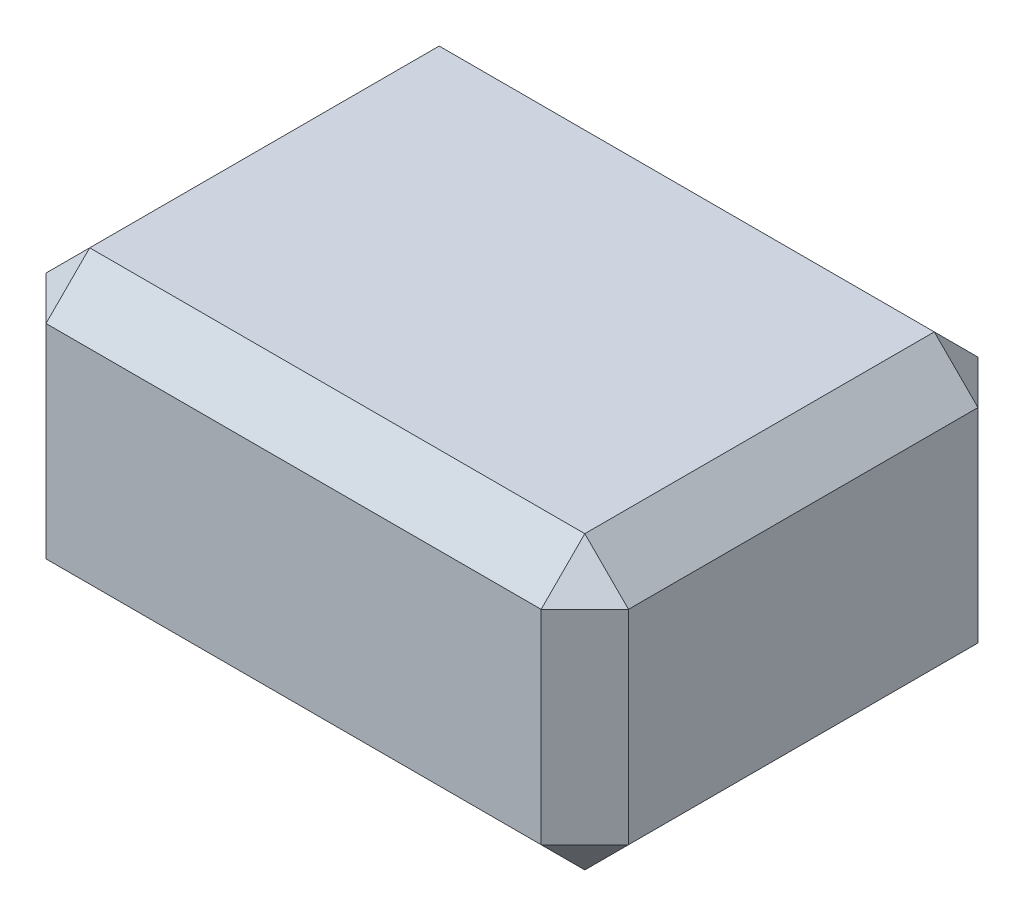
ISO-10303-21;
HEADER;
FILE_DESCRIPTION(('STEP AP214'),'2;1');
FILE_NAME('part.step','',(''),(''),'','','');
FILE_SCHEMA(('AUTOMOTIVE_DESIGN { 1 0 10303 214 1 1 1 1 }'));
ENDSEC;
DATA;
#1=APPLICATION_CONTEXT('core data for automotive mechanical design processes');
#2=APPLICATION_PROTOCOL_DEFINITION('international standard','automotive_design',2000,#1);
#3=PRODUCT_CONTEXT('',#1,'mechanical');
#4=PRODUCT('Part','Part','',(#3));
#5=PRODUCT_RELATED_PRODUCT_CATEGORY('part','',(#4));
#6=PRODUCT_DEFINITION_FORMATION('','',#4);
#7=PRODUCT_DEFINITION_CONTEXT('part definition',#1,'design');
#8=PRODUCT_DEFINITION('design','',#6,#7);
#9=PRODUCT_DEFINITION_SHAPE('','',#8);
#10=(LENGTH_UNIT() NAMED_UNIT(*) SI_UNIT(.MILLI.,.METRE.));
#11=(NAMED_UNIT(*) PLANE_ANGLE_UNIT() SI_UNIT($,.RADIAN.));
#12=(NAMED_UNIT(*) SI_UNIT($,.STERADIAN.) SOLID_ANGLE_UNIT());
#13=UNCERTAINTY_MEASURE_WITH_UNIT(LENGTH_MEASURE(1.E-05),#10,'distance_accuracy_value','');
#14=(GEOMETRIC_REPRESENTATION_CONTEXT(3) GLOBAL_UNCERTAINTY_ASSIGNED_CONTEXT((#13)) GLOBAL_UNIT_ASSIGNED_CONTEXT((#10,
#11,#12)) REPRESENTATION_CONTEXT('',''));
#15=CARTESIAN_POINT('',(0.,0.,0.));
#16=DIRECTION('',(0.,0.,1.));
#17=DIRECTION('',(1.,0.,0.));
#18=AXIS2_PLACEMENT_3D('',#15,#16,#17);
#19=CARTESIAN_POINT('',(-20.,20.,-15.));
#20=DIRECTION('',(1.,0.,0.));
#21=DIRECTION('',(0.,0.,-1.));
#22=AXIS2_PLACEMENT_3D('',#19,#20,#21);
#23=PLANE('',#22);
#24=DIRECTION('',(0.,0.,-1.));
#25=VECTOR('',#24,1.);
#26=CARTESIAN_POINT('',(-20.,17.,-15.));
#27=LINE('',#26,#25);
#28=CARTESIAN_POINT('',(-20.,17.,12.));
#29=VERTEX_POINT('',#28);
#30=CARTESIAN_POINT('',(-20.,17.,-12.));
#31=VERTEX_POINT('',#30);
#32=EDGE_CURVE('E162',#29,#31,#27,.T.);
#33=ORIENTED_EDGE('',*,*,#32,.T.);
#34=DIRECTION('',(0.,-1.,0.));
#35=VECTOR('',#34,1.);
#36=CARTESIAN_POINT('',(-20.,20.,-12.));
#37=LINE('',#36,#35);
#38=CARTESIAN_POINT('',(-20.,3.00000000000002,-12.));
#39=VERTEX_POINT('',#38);
#40=EDGE_CURVE('E165',#31,#39,#37,.T.);
#41=ORIENTED_EDGE('',*,*,#40,.T.);
#42=DIRECTION('',(0.,0.,1.));
#43=VECTOR('',#42,1.);
#44=CARTESIAN_POINT('',(-20.,3.00000000000002,-15.));
#45=LINE('',#44,#43);
#46=CARTESIAN_POINT('',(-20.,3.00000000000002,12.));
#47=VERTEX_POINT('',#46);
#48=EDGE_CURVE('E138',#39,#47,#45,.T.);
#49=ORIENTED_EDGE('',*,*,#48,.T.);
#50=DIRECTION('',(0.,1.,0.));
#51=VECTOR('',#50,1.);
#52=CARTESIAN_POINT('',(-20.,20.,12.));
#53=LINE('',#52,#51);
#54=EDGE_CURVE('E156',#47,#29,#53,.T.);
#55=ORIENTED_EDGE('',*,*,#54,.T.);
#56=EDGE_LOOP('',(#33,#41,#49,#55));
#57=FACE_BOUND('',#56,.T.);
#58=ADVANCED_FACE('F43',(#57),#23,.F.);
#59=CARTESIAN_POINT('',(-20.,20.,15.));
#60=DIRECTION('',(0.,0.,-1.));
#61=DIRECTION('',(-1.,0.,0.));
#62=AXIS2_PLACEMENT_3D('',#59,#60,#61);
#63=PLANE('',#62);
#64=DIRECTION('',(0.,-1.,0.));
#65=VECTOR('',#64,1.);
#66=CARTESIAN_POINT('',(-17.0000009803845,20.,15.));
#67=LINE('',#66,#65);
#68=CARTESIAN_POINT('',(-17.0000009803845,17.0000009803845,15.));
#69=VERTEX_POINT('',#68);
#70=CARTESIAN_POINT('',(-17.0000009803845,2.99999901961547,15.));
#71=VERTEX_POINT('',#70);
#72=EDGE_CURVE('E178',#69,#71,#67,.T.);
#73=ORIENTED_EDGE('',*,*,#72,.T.);
#74=DIRECTION('',(1.,0.,0.));
#75=VECTOR('',#74,1.);
#76=CARTESIAN_POINT('',(-20.,2.99999901961547,15.));
#77=LINE('',#76,#75);
#78=CARTESIAN_POINT('',(17.0000009803845,2.99999901961547,15.));
#79=VERTEX_POINT('',#78);
#80=EDGE_CURVE('E184',#71,#79,#77,.T.);
#81=ORIENTED_EDGE('',*,*,#80,.T.);
#82=DIRECTION('',(0.,1.,0.));
#83=VECTOR('',#82,1.);
#84=CARTESIAN_POINT('',(17.0000009803845,20.,15.));
#85=LINE('',#84,#83);
#86=CARTESIAN_POINT('',(17.0000009803845,17.0000009803845,15.));
#87=VERTEX_POINT('',#86);
#88=EDGE_CURVE('E182',#79,#87,#85,.T.);
#89=ORIENTED_EDGE('',*,*,#88,.T.);
#90=DIRECTION('',(-1.,0.,0.));
#91=VECTOR('',#90,1.);
#92=CARTESIAN_POINT('',(-20.,17.0000009803845,15.));
#93=LINE('',#92,#91);
#94=EDGE_CURVE('E180',#87,#69,#93,.T.);
#95=ORIENTED_EDGE('',*,*,#94,.T.);
#96=EDGE_LOOP('',(#73,#81,#89,#95));
#97=FACE_BOUND('',#96,.T.);
#98=ADVANCED_FACE('F334',(#97),#63,.F.);
#99=CARTESIAN_POINT('',(20.,20.,15.));
#100=DIRECTION('',(-1.,0.,0.));
#101=DIRECTION('',(0.,0.,1.));
#102=AXIS2_PLACEMENT_3D('',#99,#100,#101);
#103=PLANE('',#102);
#104=DIRECTION('',(0.,-1.,0.));
#105=VECTOR('',#104,1.);
#106=CARTESIAN_POINT('',(20.,20.,12.));
#107=LINE('',#106,#105);
#108=CARTESIAN_POINT('',(20.,17.,12.));
#109=VERTEX_POINT('',#108);
#110=CARTESIAN_POINT('',(20.,2.99999901961547,12.));
#111=VERTEX_POINT('',#110);
#112=EDGE_CURVE('E187',#109,#111,#107,.T.);
#113=ORIENTED_EDGE('',*,*,#112,.T.);
#114=DIRECTION('',(0.,0.,-1.));
#115=VECTOR('',#114,1.);
#116=CARTESIAN_POINT('',(20.,2.99999901961547,15.));
#117=LINE('',#116,#115);
#118=CARTESIAN_POINT('',(20.,2.99999901961547,-12.));
#119=VERTEX_POINT('',#118);
#120=EDGE_CURVE('E193',#111,#119,#117,.T.);
#121=ORIENTED_EDGE('',*,*,#120,.T.);
#122=DIRECTION('',(0.,1.,0.));
#123=VECTOR('',#122,1.);
#124=CARTESIAN_POINT('',(20.,20.,-12.));
#125=LINE('',#124,#123);
#126=CARTESIAN_POINT('',(20.,17.,-12.));
#127=VERTEX_POINT('',#126);
#128=EDGE_CURVE('E191',#119,#127,#125,.T.);
#129=ORIENTED_EDGE('',*,*,#128,.T.);
#130=DIRECTION('',(0.,0.,1.));
#131=VECTOR('',#130,1.);
#132=CARTESIAN_POINT('',(20.,17.,15.));
#133=LINE('',#132,#131);
#134=EDGE_CURVE('E189',#127,#109,#133,.T.);
#135=ORIENTED_EDGE('',*,*,#134,.T.);
#136=EDGE_LOOP('',(#113,#121,#129,#135));
#137=FACE_BOUND('',#136,.T.);
#138=ADVANCED_FACE('F304',(#137),#103,.F.);
#139=CARTESIAN_POINT('',(20.,20.,-15.));
#140=DIRECTION('',(0.,0.,1.));
#141=DIRECTION('',(1.,0.,0.));
#142=AXIS2_PLACEMENT_3D('',#139,#140,#141);
#143=PLANE('',#142);
#144=DIRECTION('',(0.,-1.,0.));
#145=VECTOR('',#144,1.);
#146=CARTESIAN_POINT('',(17.0000009803845,20.,-15.));
#147=LINE('',#146,#145);
#148=CARTESIAN_POINT('',(17.0000009803845,17.,-15.));
#149=VERTEX_POINT('',#148);
#150=CARTESIAN_POINT('',(17.0000009803845,2.99999901961547,-15.));
#151=VERTEX_POINT('',#150);
#152=EDGE_CURVE('E196',#149,#151,#147,.T.);
#153=ORIENTED_EDGE('',*,*,#152,.T.);
#154=DIRECTION('',(-1.,0.,0.));
#155=VECTOR('',#154,1.);
#156=CARTESIAN_POINT('',(20.,2.99999901961547,-15.));
#157=LINE('',#156,#155);
#158=CARTESIAN_POINT('',(-17.0000009803845,2.99999901961547,-15.));
#159=VERTEX_POINT('',#158);
#160=EDGE_CURVE('E202',#151,#159,#157,.T.);
#161=ORIENTED_EDGE('',*,*,#160,.T.);
#162=DIRECTION('',(0.,1.,0.));
#163=VECTOR('',#162,1.);
#164=CARTESIAN_POINT('',(-17.0000009803845,20.,-15.));
#165=LINE('',#164,#163);
#166=CARTESIAN_POINT('',(-17.0000009803845,17.,-15.));
#167=VERTEX_POINT('',#166);
#168=EDGE_CURVE('E200',#159,#167,#165,.T.);
#169=ORIENTED_EDGE('',*,*,#168,.T.);
#170=DIRECTION('',(1.,0.,0.));
#171=VECTOR('',#170,1.);
#172=CARTESIAN_POINT('',(20.,17.,-15.));
#173=LINE('',#172,#171);
#174=EDGE_CURVE('E198',#167,#149,#173,.T.);
#175=ORIENTED_EDGE('',*,*,#174,.T.);
#176=EDGE_LOOP('',(#153,#161,#169,#175));
#177=FACE_BOUND('',#176,.T.);
#178=ADVANCED_FACE('F277',(#177),#143,.F.);
#179=CARTESIAN_POINT('',(0.,20.,0.));
#180=DIRECTION('',(0.,1.,0.));
#181=DIRECTION('',(0.,0.,1.));
#182=AXIS2_PLACEMENT_3D('',#179,#180,#181);
#183=PLANE('',#182);
#184=DIRECTION('',(-1.,0.,0.));
#185=VECTOR('',#184,1.);
#186=CARTESIAN_POINT('',(-20.,20.,-12.0000009803845));
#187=LINE('',#186,#185);
#188=CARTESIAN_POINT('',(17.0000009803845,20.,-12.0000009803845));
#189=VERTEX_POINT('',#188);
#190=CARTESIAN_POINT('',(-17.0000009803845,20.,-12.0000009803845));
#191=VERTEX_POINT('',#190);
#192=EDGE_CURVE('E53',#189,#191,#187,.T.);
#193=ORIENTED_EDGE('',*,*,#192,.T.);
#194=DIRECTION('',(0.,0.,1.));
#195=VECTOR('',#194,1.);
#196=CARTESIAN_POINT('',(-17.0000009803845,20.,15.));
#197=LINE('',#196,#195);
#198=CARTESIAN_POINT('',(-17.0000009803845,20.,12.));
#199=VERTEX_POINT('',#198);
#200=EDGE_CURVE('E11',#191,#199,#197,.T.);
#201=ORIENTED_EDGE('',*,*,#200,.T.);
#202=DIRECTION('',(1.,0.,0.));
#203=VECTOR('',#202,1.);
#204=CARTESIAN_POINT('',(20.,20.,12.));
#205=LINE('',#204,#203);
#206=CARTESIAN_POINT('',(17.0000009803845,20.,12.));
#207=VERTEX_POINT('',#206);
#208=EDGE_CURVE('E205',#199,#207,#205,.T.);
#209=ORIENTED_EDGE('',*,*,#208,.T.);
#210=DIRECTION('',(0.,0.,-1.));
#211=VECTOR('',#210,1.);
#212=CARTESIAN_POINT('',(17.0000009803845,20.,-15.));
#213=LINE('',#212,#211);
#214=EDGE_CURVE('E64',#207,#189,#213,.T.);
#215=ORIENTED_EDGE('',*,*,#214,.T.);
#216=EDGE_LOOP('',(#193,#201,#209,#215));
#217=FACE_BOUND('',#216,.T.);
#218=ADVANCED_FACE('F292',(#217),#183,.T.);
#219=CARTESIAN_POINT('',(0.,0.,0.));
#220=DIRECTION('',(0.,1.,0.));
#221=DIRECTION('',(0.,0.,1.));
#222=AXIS2_PLACEMENT_3D('',#219,#220,#221);
#223=PLANE('',#222);
#224=DIRECTION('',(-1.,0.,0.));
#225=VECTOR('',#224,1.);
#226=CARTESIAN_POINT('',(0.,0.,12.));
#227=LINE('',#226,#225);
#228=CARTESIAN_POINT('',(17.,0.,12.));
#229=VERTEX_POINT('',#228);
#230=CARTESIAN_POINT('',(-17.0000009803845,0.,12.));
#231=VERTEX_POINT('',#230);
#232=EDGE_CURVE('E175',#229,#231,#227,.T.);
#233=ORIENTED_EDGE('',*,*,#232,.T.);
#234=DIRECTION('',(0.,0.,-1.));
#235=VECTOR('',#234,1.);
#236=CARTESIAN_POINT('',(-17.0000009803845,0.,0.));
#237=LINE('',#236,#235);
#238=CARTESIAN_POINT('',(-17.0000009803845,0.,-12.));
#239=VERTEX_POINT('',#238);
#240=EDGE_CURVE('E140',#231,#239,#237,.T.);
#241=ORIENTED_EDGE('',*,*,#240,.T.);
#242=DIRECTION('',(1.,0.,0.));
#243=VECTOR('',#242,1.);
#244=CARTESIAN_POINT('',(0.,0.,-12.));
#245=LINE('',#244,#243);
#246=CARTESIAN_POINT('',(17.,0.,-12.));
#247=VERTEX_POINT('',#246);
#248=EDGE_CURVE('E168',#239,#247,#245,.T.);
#249=ORIENTED_EDGE('',*,*,#248,.T.);
#250=DIRECTION('',(0.,0.,1.));
#251=VECTOR('',#250,1.);
#252=CARTESIAN_POINT('',(17.,0.,0.));
#253=LINE('',#252,#251);
#254=EDGE_CURVE('E173',#247,#229,#253,.T.);
#255=ORIENTED_EDGE('',*,*,#254,.T.);
#256=EDGE_LOOP('',(#233,#241,#249,#255));
#257=FACE_BOUND('',#256,.T.);
#258=ADVANCED_FACE('F424',(#257),#223,.F.);
#259=CARTESIAN_POINT('',(17.0000009803845,20.,0.));
#260=DIRECTION('',(0.707106896725984,0.707106665647092,0.));
#261=DIRECTION('',(0.,0.,1.));
#262=AXIS2_PLACEMENT_3D('',#259,#260,#261);
#263=PLANE('',#262);
#264=DIRECTION('',(0.707106665647073,-0.707106896725965,2.31078892403524E-07));
#265=VECTOR('',#264,1.);
#266=CARTESIAN_POINT('',(18.5000004901923,18.5,-12.0000004901923));
#267=LINE('',#266,#265);
#268=EDGE_CURVE('E48',#189,#127,#267,.T.);
#269=ORIENTED_EDGE('',*,*,#268,.F.);
#270=ORIENTED_EDGE('',*,*,#214,.F.);
#271=DIRECTION('',(-0.707106665647092,0.707106896725984,0.));
#272=VECTOR('',#271,1.);
#273=CARTESIAN_POINT('',(20.,17.,12.));
#274=LINE('',#273,#272);
#275=EDGE_CURVE('E257',#109,#207,#274,.T.);
#276=ORIENTED_EDGE('',*,*,#275,.F.);
#277=ORIENTED_EDGE('',*,*,#134,.F.);
#278=EDGE_LOOP('',(#269,#270,#276,#277));
#279=FACE_BOUND('',#278,.T.);
#280=ADVANCED_FACE('F46',(#279),#263,.T.);
#281=CARTESIAN_POINT('',(17.0000009803845,17.,-15.));
#282=DIRECTION('',(0.577350457864741,0.57735008051449,-0.577350269189585));
#283=DIRECTION('',(-0.707106665647092,0.,-0.707106896725984));
#284=AXIS2_PLACEMENT_3D('',#281,#282,#283);
#285=PLANE('',#284);
#286=DIRECTION('',(0.,0.707106896725984,0.707106665647092));
#287=VECTOR('',#286,1.);
#288=CARTESIAN_POINT('',(17.0000009803845,17.,-15.));
#289=LINE('',#288,#287);
#290=EDGE_CURVE('E252',#189,#149,#289,.F.);
#291=ORIENTED_EDGE('',*,*,#290,.F.);
#292=ORIENTED_EDGE('',*,*,#268,.T.);
#293=DIRECTION('',(0.707106665647092,0.,0.707106896725984));
#294=VECTOR('',#293,1.);
#295=CARTESIAN_POINT('',(17.0000009803845,17.,-15.));
#296=LINE('',#295,#294);
#297=EDGE_CURVE('E255',#149,#127,#296,.T.);
#298=ORIENTED_EDGE('',*,*,#297,.F.);
#299=EDGE_LOOP('',(#291,#292,#298));
#300=FACE_BOUND('',#299,.T.);
#301=ADVANCED_FACE('F267',(#300),#285,.T.);
#302=CARTESIAN_POINT('',(20.,17.,12.));
#303=DIRECTION('',(0.577350457864741,0.577350269189585,0.57735008051449));
#304=DIRECTION('',(-0.707106665647092,0.707106896725984,0.));
#305=AXIS2_PLACEMENT_3D('',#302,#303,#304);
#306=PLANE('',#305);
#307=DIRECTION('',(-0.707106665647073,2.31078892414246E-07,0.707106896725965));
#308=VECTOR('',#307,1.);
#309=CARTESIAN_POINT('',(20.,17.,12.));
#310=LINE('',#309,#308);
#311=EDGE_CURVE('E246',#109,#87,#310,.T.);
#312=ORIENTED_EDGE('',*,*,#311,.F.);
#313=ORIENTED_EDGE('',*,*,#275,.T.);
#314=DIRECTION('',(0.,-0.707106665647092,0.707106896725984));
#315=VECTOR('',#314,1.);
#316=CARTESIAN_POINT('',(17.0000009803845,18.5000004901923,13.4999999999999));
#317=LINE('',#316,#315);
#318=EDGE_CURVE('E249',#87,#207,#317,.F.);
#319=ORIENTED_EDGE('',*,*,#318,.F.);
#320=EDGE_LOOP('',(#312,#313,#319));
#321=FACE_BOUND('',#320,.T.);
#322=ADVANCED_FACE('F296',(#321),#306,.T.);
#323=CARTESIAN_POINT('',(17.0000009803845,20.,-15.));
#324=DIRECTION('',(-0.707106896725984,0.,0.707106665647092));
#325=DIRECTION('',(0.,-1.,0.));
#326=AXIS2_PLACEMENT_3D('',#323,#324,#325);
#327=PLANE('',#326);
#328=ORIENTED_EDGE('',*,*,#297,.T.);
#329=ORIENTED_EDGE('',*,*,#128,.F.);
#330=DIRECTION('',(-0.707106665647092,0.,-0.707106896725984));
#331=VECTOR('',#330,1.);
#332=CARTESIAN_POINT('',(20.,2.99999901961546,-12.));
#333=LINE('',#332,#331);
#334=EDGE_CURVE('E241',#151,#119,#333,.F.);
#335=ORIENTED_EDGE('',*,*,#334,.F.);
#336=ORIENTED_EDGE('',*,*,#152,.F.);
#337=EDGE_LOOP('',(#328,#329,#335,#336));
#338=FACE_BOUND('',#337,.T.);
#339=ADVANCED_FACE('F273',(#338),#327,.F.);
#340=CARTESIAN_POINT('',(0.,20.,-12.0000009803845));
#341=DIRECTION('',(0.,0.707106665647092,-0.707106896725984));
#342=DIRECTION('',(1.,0.,0.));
#343=AXIS2_PLACEMENT_3D('',#340,#341,#342);
#344=PLANE('',#343);
#345=ORIENTED_EDGE('',*,*,#290,.T.);
#346=ORIENTED_EDGE('',*,*,#174,.F.);
#347=DIRECTION('',(0.,-0.707106896725984,-0.707106665647092));
#348=VECTOR('',#347,1.);
#349=CARTESIAN_POINT('',(-17.0000009803845,18.4999999999999,-13.5000004901923));
#350=LINE('',#349,#348);
#351=EDGE_CURVE('E238',#191,#167,#350,.T.);
#352=ORIENTED_EDGE('',*,*,#351,.F.);
#353=ORIENTED_EDGE('',*,*,#192,.F.);
#354=EDGE_LOOP('',(#345,#346,#352,#353));
#355=FACE_BOUND('',#354,.T.);
#356=ADVANCED_FACE('F283',(#355),#344,.T.);
#357=CARTESIAN_POINT('',(-17.0000009803845,20.,0.));
#358=DIRECTION('',(-0.707106896725984,0.707106665647092,0.));
#359=DIRECTION('',(0.,0.,-1.));
#360=AXIS2_PLACEMENT_3D('',#357,#358,#359);
#361=PLANE('',#360);
#362=DIRECTION('',(-0.707106665647092,-0.707106896725984,0.));
#363=VECTOR('',#362,1.);
#364=CARTESIAN_POINT('',(-17.0000009803845,20.,12.));
#365=LINE('',#364,#363);
#366=EDGE_CURVE('E232',#199,#29,#365,.T.);
#367=ORIENTED_EDGE('',*,*,#366,.F.);
#368=ORIENTED_EDGE('',*,*,#200,.F.);
#369=DIRECTION('',(0.707106665647073,0.707106896725965,-2.31078892403524E-07));
#370=VECTOR('',#369,1.);
#371=CARTESIAN_POINT('',(-20.,17.,-12.));
#372=LINE('',#371,#370);
#373=EDGE_CURVE('E235',#31,#191,#372,.T.);
#374=ORIENTED_EDGE('',*,*,#373,.F.);
#375=ORIENTED_EDGE('',*,*,#32,.F.);
#376=EDGE_LOOP('',(#367,#368,#374,#375));
#377=FACE_BOUND('',#376,.T.);
#378=ADVANCED_FACE('F290',(#377),#361,.T.);
#379=CARTESIAN_POINT('',(0.,20.,12.));
#380=DIRECTION('',(0.,0.707106896725984,0.707106665647092));
#381=DIRECTION('',(-1.,0.,0.));
#382=AXIS2_PLACEMENT_3D('',#379,#380,#381);
#383=PLANE('',#382);
#384=ORIENTED_EDGE('',*,*,#318,.T.);
#385=ORIENTED_EDGE('',*,*,#208,.F.);
#386=DIRECTION('',(0.,0.707106665647092,-0.707106896725984));
#387=VECTOR('',#386,1.);
#388=CARTESIAN_POINT('',(-17.0000009803845,20.,12.));
#389=LINE('',#388,#387);
#390=EDGE_CURVE('E230',#69,#199,#389,.T.);
#391=ORIENTED_EDGE('',*,*,#390,.F.);
#392=ORIENTED_EDGE('',*,*,#94,.F.);
#393=EDGE_LOOP('',(#384,#385,#391,#392));
#394=FACE_BOUND('',#393,.T.);
#395=ADVANCED_FACE('F398',(#394),#383,.T.);
#396=CARTESIAN_POINT('',(20.,20.,12.));
#397=DIRECTION('',(-0.707106896725984,0.,-0.707106665647092));
#398=DIRECTION('',(0.,-1.,0.));
#399=AXIS2_PLACEMENT_3D('',#396,#397,#398);
#400=PLANE('',#399);
#401=ORIENTED_EDGE('',*,*,#311,.T.);
#402=ORIENTED_EDGE('',*,*,#88,.F.);
#403=DIRECTION('',(0.707106665647092,0.,-0.707106896725984));
#404=VECTOR('',#403,1.);
#405=CARTESIAN_POINT('',(17.0000009803845,2.99999901961547,15.));
#406=LINE('',#405,#404);
#407=EDGE_CURVE('E227',#111,#79,#406,.F.);
#408=ORIENTED_EDGE('',*,*,#407,.F.);
#409=ORIENTED_EDGE('',*,*,#112,.F.);
#410=EDGE_LOOP('',(#401,#402,#408,#409));
#411=FACE_BOUND('',#410,.T.);
#412=ADVANCED_FACE('F301',(#411),#400,.F.);
#413=CARTESIAN_POINT('',(20.,2.99999901961547,15.));
#414=DIRECTION('',(-0.707106665647092,0.707106896725984,0.));
#415=DIRECTION('',(0.,0.,-1.));
#416=AXIS2_PLACEMENT_3D('',#413,#414,#415);
#417=PLANE('',#416);
#418=DIRECTION('',(0.707106896725984,0.707106665647092,0.));
#419=VECTOR('',#418,1.);
#420=CARTESIAN_POINT('',(20.,2.99999901961547,-12.));
#421=LINE('',#420,#419);
#422=EDGE_CURVE('E243',#119,#247,#421,.F.);
#423=ORIENTED_EDGE('',*,*,#422,.F.);
#424=ORIENTED_EDGE('',*,*,#120,.F.);
#425=DIRECTION('',(-0.707106896725984,-0.707106665647092,0.));
#426=VECTOR('',#425,1.);
#427=CARTESIAN_POINT('',(18.5000000000001,1.49999950980781,12.));
#428=LINE('',#427,#426);
#429=EDGE_CURVE('E224',#229,#111,#428,.F.);
#430=ORIENTED_EDGE('',*,*,#429,.F.);
#431=ORIENTED_EDGE('',*,*,#254,.F.);
#432=EDGE_LOOP('',(#423,#424,#430,#431));
#433=FACE_BOUND('',#432,.T.);
#434=ADVANCED_FACE('F308',(#433),#417,.F.);
#435=CARTESIAN_POINT('',(20.,2.99999901961547,-12.));
#436=DIRECTION('',(0.577350269189585,-0.577350457864741,-0.57735008051449));
#437=DIRECTION('',(0.707106896725984,0.707106665647092,0.));
#438=AXIS2_PLACEMENT_3D('',#435,#436,#437);
#439=PLANE('',#438);
#440=ORIENTED_EDGE('',*,*,#334,.T.);
#441=ORIENTED_EDGE('',*,*,#422,.T.);
#442=DIRECTION('',(-2.31078892414246E-07,-0.707106665647073,0.707106896725965));
#443=VECTOR('',#442,1.);
#444=CARTESIAN_POINT('',(17.0000004901923,1.49999950980773,-13.5));
#445=LINE('',#444,#443);
#446=EDGE_CURVE('E221',#151,#247,#445,.T.);
#447=ORIENTED_EDGE('',*,*,#446,.F.);
#448=EDGE_LOOP('',(#440,#441,#447));
#449=FACE_BOUND('',#448,.T.);
#450=ADVANCED_FACE('F312',(#449),#439,.T.);
#451=CARTESIAN_POINT('',(-20.,17.,-12.));
#452=DIRECTION('',(-0.577350457864741,0.57735008051449,-0.577350269189585));
#453=DIRECTION('',(-0.707106665647092,0.,0.707106896725984));
#454=AXIS2_PLACEMENT_3D('',#451,#452,#453);
#455=PLANE('',#454);
#456=ORIENTED_EDGE('',*,*,#373,.T.);
#457=ORIENTED_EDGE('',*,*,#351,.T.);
#458=DIRECTION('',(0.707106665647092,0.,-0.707106896725984));
#459=VECTOR('',#458,1.);
#460=CARTESIAN_POINT('',(-20.,17.,-12.));
#461=LINE('',#460,#459);
#462=EDGE_CURVE('E218',#31,#167,#461,.T.);
#463=ORIENTED_EDGE('',*,*,#462,.F.);
#464=EDGE_LOOP('',(#456,#457,#463));
#465=FACE_BOUND('',#464,.T.);
#466=ADVANCED_FACE('F287',(#465),#455,.T.);
#467=CARTESIAN_POINT('',(-17.0000009803845,20.,12.));
#468=DIRECTION('',(-0.577350457864741,0.577350269189585,0.57735008051449));
#469=DIRECTION('',(-0.707106665647092,-0.707106896725984,0.));
#470=AXIS2_PLACEMENT_3D('',#467,#468,#469);
#471=PLANE('',#470);
#472=ORIENTED_EDGE('',*,*,#390,.T.);
#473=ORIENTED_EDGE('',*,*,#366,.T.);
#474=DIRECTION('',(-0.707106665647073,-2.31078892414246E-07,-0.707106896725965));
#475=VECTOR('',#474,1.);
#476=CARTESIAN_POINT('',(-18.5000004901923,17.0000004901923,13.5));
#477=LINE('',#476,#475);
#478=EDGE_CURVE('E159',#69,#29,#477,.T.);
#479=ORIENTED_EDGE('',*,*,#478,.F.);
#480=EDGE_LOOP('',(#472,#473,#479));
#481=FACE_BOUND('',#480,.T.);
#482=ADVANCED_FACE('F377',(#481),#471,.T.);
#483=CARTESIAN_POINT('',(17.0000009803845,2.99999901961547,15.));
#484=DIRECTION('',(0.577350269189585,-0.577350457864741,0.57735008051449));
#485=DIRECTION('',(0.707106896725984,0.707106665647092,0.));
#486=AXIS2_PLACEMENT_3D('',#483,#484,#485);
#487=PLANE('',#486);
#488=ORIENTED_EDGE('',*,*,#429,.T.);
#489=ORIENTED_EDGE('',*,*,#407,.T.);
#490=DIRECTION('',(2.31078892510394E-07,0.707106665647073,0.707106896725965));
#491=VECTOR('',#490,1.);
#492=CARTESIAN_POINT('',(17.0000009803845,2.99999901961547,15.));
#493=LINE('',#492,#491);
#494=EDGE_CURVE('E215',#229,#79,#493,.T.);
#495=ORIENTED_EDGE('',*,*,#494,.F.);
#496=EDGE_LOOP('',(#488,#489,#495));
#497=FACE_BOUND('',#496,.T.);
#498=ADVANCED_FACE('F372',(#497),#487,.T.);
#499=CARTESIAN_POINT('',(20.,2.99999901961547,-15.));
#500=DIRECTION('',(0.,0.707106896725984,0.707106665647092));
#501=DIRECTION('',(-1.,0.,0.));
#502=AXIS2_PLACEMENT_3D('',#499,#500,#501);
#503=PLANE('',#502);
#504=ORIENTED_EDGE('',*,*,#446,.T.);
#505=ORIENTED_EDGE('',*,*,#248,.F.);
#506=DIRECTION('',(0.,0.707106665647092,-0.707106896725984));
#507=VECTOR('',#506,1.);
#508=CARTESIAN_POINT('',(-17.0000009803845,0.,-12.));
#509=LINE('',#508,#507);
#510=EDGE_CURVE('E212',#159,#239,#509,.F.);
#511=ORIENTED_EDGE('',*,*,#510,.F.);
#512=ORIENTED_EDGE('',*,*,#160,.F.);
#513=EDGE_LOOP('',(#504,#505,#511,#512));
#514=FACE_BOUND('',#513,.T.);
#515=ADVANCED_FACE('F315',(#514),#503,.F.);
#516=CARTESIAN_POINT('',(-20.,20.,-12.));
#517=DIRECTION('',(0.707106896725984,0.,0.707106665647092));
#518=DIRECTION('',(0.,-1.,0.));
#519=AXIS2_PLACEMENT_3D('',#516,#517,#518);
#520=PLANE('',#519);
#521=ORIENTED_EDGE('',*,*,#462,.T.);
#522=ORIENTED_EDGE('',*,*,#168,.F.);
#523=DIRECTION('',(-0.707106665647073,2.31078892414246E-07,0.707106896725965));
#524=VECTOR('',#523,1.);
#525=CARTESIAN_POINT('',(-18.5000004901923,2.99999950980774,-13.5));
#526=LINE('',#525,#524);
#527=EDGE_CURVE('E153',#39,#159,#526,.F.);
#528=ORIENTED_EDGE('',*,*,#527,.F.);
#529=ORIENTED_EDGE('',*,*,#40,.F.);
#530=EDGE_LOOP('',(#521,#522,#528,#529));
#531=FACE_BOUND('',#530,.T.);
#532=ADVANCED_FACE('F320',(#531),#520,.F.);
#533=CARTESIAN_POINT('',(-17.0000009803845,20.,15.));
#534=DIRECTION('',(0.707106896725984,0.,-0.707106665647092));
#535=DIRECTION('',(0.,-1.,0.));
#536=AXIS2_PLACEMENT_3D('',#533,#534,#535);
#537=PLANE('',#536);
#538=ORIENTED_EDGE('',*,*,#478,.T.);
#539=ORIENTED_EDGE('',*,*,#54,.F.);
#540=DIRECTION('',(0.707106665647073,-2.31078892414246E-07,0.707106896725965));
#541=VECTOR('',#540,1.);
#542=CARTESIAN_POINT('',(-20.,3.00000000000002,12.));
#543=LINE('',#542,#541);
#544=EDGE_CURVE('E146',#71,#47,#543,.F.);
#545=ORIENTED_EDGE('',*,*,#544,.F.);
#546=ORIENTED_EDGE('',*,*,#72,.F.);
#547=EDGE_LOOP('',(#538,#539,#545,#546));
#548=FACE_BOUND('',#547,.T.);
#549=ADVANCED_FACE('F157',(#548),#537,.F.);
#550=CARTESIAN_POINT('',(-20.,2.99999901961547,15.));
#551=DIRECTION('',(0.,0.707106896725984,-0.707106665647092));
#552=DIRECTION('',(1.,0.,0.));
#553=AXIS2_PLACEMENT_3D('',#550,#551,#552);
#554=PLANE('',#553);
#555=ORIENTED_EDGE('',*,*,#494,.T.);
#556=ORIENTED_EDGE('',*,*,#80,.F.);
#557=DIRECTION('',(0.,-0.707106665647092,-0.707106896725984));
#558=VECTOR('',#557,1.);
#559=CARTESIAN_POINT('',(-17.0000009803845,1.49999950980765,13.4999999999999));
#560=LINE('',#559,#558);
#561=EDGE_CURVE('E150',#231,#71,#560,.F.);
#562=ORIENTED_EDGE('',*,*,#561,.F.);
#563=ORIENTED_EDGE('',*,*,#232,.F.);
#564=EDGE_LOOP('',(#555,#556,#562,#563));
#565=FACE_BOUND('',#564,.T.);
#566=ADVANCED_FACE('F323',(#565),#554,.F.);
#567=CARTESIAN_POINT('',(-17.0000009803845,0.,-12.));
#568=DIRECTION('',(-0.577350457864741,-0.577350269189585,-0.57735008051449));
#569=DIRECTION('',(0.707106665647092,-0.707106896725984,0.));
#570=AXIS2_PLACEMENT_3D('',#567,#568,#569);
#571=PLANE('',#570);
#572=ORIENTED_EDGE('',*,*,#527,.T.);
#573=ORIENTED_EDGE('',*,*,#510,.T.);
#574=DIRECTION('',(0.707106665647092,-0.707106896725984,0.));
#575=VECTOR('',#574,1.);
#576=CARTESIAN_POINT('',(-17.0000009803845,0.,-12.));
#577=LINE('',#576,#575);
#578=EDGE_CURVE('E143',#39,#239,#577,.T.);
#579=ORIENTED_EDGE('',*,*,#578,.F.);
#580=EDGE_LOOP('',(#572,#573,#579));
#581=FACE_BOUND('',#580,.T.);
#582=ADVANCED_FACE('F321',(#581),#571,.T.);
#583=CARTESIAN_POINT('',(-20.,3.00000000000002,12.));
#584=DIRECTION('',(-0.577350457864741,-0.577350269189585,0.57735008051449));
#585=DIRECTION('',(0.707106665647092,-0.707106896725984,0.));
#586=AXIS2_PLACEMENT_3D('',#583,#584,#585);
#587=PLANE('',#586);
#588=ORIENTED_EDGE('',*,*,#561,.T.);
#589=ORIENTED_EDGE('',*,*,#544,.T.);
#590=DIRECTION('',(-0.707106665647092,0.707106896725984,0.));
#591=VECTOR('',#590,1.);
#592=CARTESIAN_POINT('',(-20.,3.00000000000002,12.));
#593=LINE('',#592,#591);
#594=EDGE_CURVE('E134',#231,#47,#593,.T.);
#595=ORIENTED_EDGE('',*,*,#594,.F.);
#596=EDGE_LOOP('',(#588,#589,#595));
#597=FACE_BOUND('',#596,.T.);
#598=ADVANCED_FACE('F148',(#597),#587,.T.);
#599=CARTESIAN_POINT('',(-20.,3.00000000000002,-15.));
#600=DIRECTION('',(0.707106896725984,0.707106665647092,0.));
#601=DIRECTION('',(0.,0.,1.));
#602=AXIS2_PLACEMENT_3D('',#599,#600,#601);
#603=PLANE('',#602);
#604=ORIENTED_EDGE('',*,*,#578,.T.);
#605=ORIENTED_EDGE('',*,*,#240,.F.);
#606=ORIENTED_EDGE('',*,*,#594,.T.);
#607=ORIENTED_EDGE('',*,*,#48,.F.);
#608=EDGE_LOOP('',(#604,#605,#606,#607));
#609=FACE_BOUND('',#608,.T.);
#610=ADVANCED_FACE('F136',(#609),#603,.F.);
#611=CLOSED_SHELL('',(#58,#98,#138,#178,#218,#258,#280,#301,#322,#339,#356,#378,#395,#412,#434,
#450,#466,#482,#498,#515,#532,#549,#566,#582,#598,#610));
#612=MANIFOLD_SOLID_BREP('B2',#611);
#613=ADVANCED_BREP_SHAPE_REPRESENTATION('',(#18,#612),#14);
#614=SHAPE_DEFINITION_REPRESENTATION(#9,#613);
ENDSEC;
END-ISO-10303-21;
